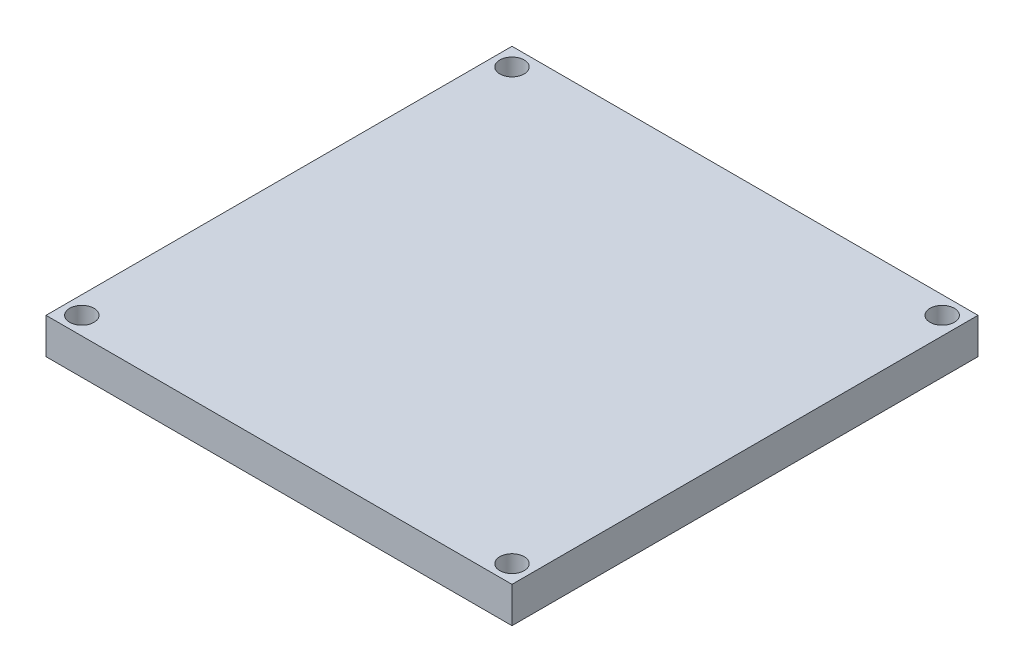
ISO-10303-21;
HEADER;
FILE_DESCRIPTION(('STEP AP214'),'2;1');
FILE_NAME('part.step','',(''),(''),'','','');
FILE_SCHEMA(('AUTOMOTIVE_DESIGN { 1 0 10303 214 1 1 1 1 }'));
ENDSEC;
DATA;
#1=APPLICATION_CONTEXT('core data for automotive mechanical design processes');
#2=APPLICATION_PROTOCOL_DEFINITION('international standard','automotive_design',2000,#1);
#3=PRODUCT_CONTEXT('',#1,'mechanical');
#4=PRODUCT('Part','Part','',(#3));
#5=PRODUCT_RELATED_PRODUCT_CATEGORY('part','',(#4));
#6=PRODUCT_DEFINITION_FORMATION('','',#4);
#7=PRODUCT_DEFINITION_CONTEXT('part definition',#1,'design');
#8=PRODUCT_DEFINITION('design','',#6,#7);
#9=PRODUCT_DEFINITION_SHAPE('','',#8);
#10=(LENGTH_UNIT() NAMED_UNIT(*) SI_UNIT(.MILLI.,.METRE.));
#11=(NAMED_UNIT(*) PLANE_ANGLE_UNIT() SI_UNIT($,.RADIAN.));
#12=(NAMED_UNIT(*) SI_UNIT($,.STERADIAN.) SOLID_ANGLE_UNIT());
#13=UNCERTAINTY_MEASURE_WITH_UNIT(LENGTH_MEASURE(1.E-05),#10,'distance_accuracy_value','');
#14=(GEOMETRIC_REPRESENTATION_CONTEXT(3) GLOBAL_UNCERTAINTY_ASSIGNED_CONTEXT((#13)) GLOBAL_UNIT_ASSIGNED_CONTEXT((#10,
#11,#12)) REPRESENTATION_CONTEXT('',''));
#15=CARTESIAN_POINT('',(0.,0.,0.));
#16=DIRECTION('',(0.,0.,1.));
#17=DIRECTION('',(1.,0.,0.));
#18=AXIS2_PLACEMENT_3D('',#15,#16,#17);
#19=CARTESIAN_POINT('',(0.,5.,0.));
#20=DIRECTION('',(0.,-1.,0.));
#21=DIRECTION('',(0.,0.,-1.));
#22=AXIS2_PLACEMENT_3D('',#19,#20,#21);
#23=PLANE('',#22);
#24=DIRECTION('',(0.,0.,1.));
#25=VECTOR('',#24,1.);
#26=CARTESIAN_POINT('',(0.,5.,0.));
#27=LINE('',#26,#25);
#28=CARTESIAN_POINT('',(0.,5.,-65.));
#29=VERTEX_POINT('',#28);
#30=CARTESIAN_POINT('',(0.,5.,0.));
#31=VERTEX_POINT('',#30);
#32=EDGE_CURVE('E98',#29,#31,#27,.T.);
#33=ORIENTED_EDGE('',*,*,#32,.T.);
#34=DIRECTION('',(1.,0.,0.));
#35=VECTOR('',#34,1.);
#36=CARTESIAN_POINT('',(0.,5.,0.));
#37=LINE('',#36,#35);
#38=CARTESIAN_POINT('',(65.,5.,0.));
#39=VERTEX_POINT('',#38);
#40=EDGE_CURVE('E93',#31,#39,#37,.T.);
#41=ORIENTED_EDGE('',*,*,#40,.T.);
#42=DIRECTION('',(0.,0.,-1.));
#43=VECTOR('',#42,1.);
#44=CARTESIAN_POINT('',(65.,5.,0.));
#45=LINE('',#44,#43);
#46=CARTESIAN_POINT('',(65.,5.,-65.));
#47=VERTEX_POINT('',#46);
#48=EDGE_CURVE('E96',#39,#47,#45,.T.);
#49=ORIENTED_EDGE('',*,*,#48,.T.);
#50=DIRECTION('',(-1.,0.,0.));
#51=VECTOR('',#50,1.);
#52=CARTESIAN_POINT('',(0.,5.,-65.));
#53=LINE('',#52,#51);
#54=EDGE_CURVE('E63',#47,#29,#53,.T.);
#55=ORIENTED_EDGE('',*,*,#54,.T.);
#56=EDGE_LOOP('',(#33,#41,#49,#55));
#57=FACE_BOUND('',#56,.T.);
#58=CARTESIAN_POINT('',(62.5,5.,-62.5));
#59=DIRECTION('',(0.,1.,0.));
#60=DIRECTION('',(0.,0.,1.));
#61=AXIS2_PLACEMENT_3D('',#58,#59,#60);
#62=CIRCLE('',#61,1.7);
#63=CARTESIAN_POINT('',(62.5,5.,-60.8));
#64=VERTEX_POINT('',#63);
#65=EDGE_CURVE('E118',#64,#64,#62,.T.);
#66=ORIENTED_EDGE('',*,*,#65,.F.);
#67=EDGE_LOOP('',(#66));
#68=FACE_BOUND('',#67,.T.);
#69=CARTESIAN_POINT('',(2.5,5.,-62.5));
#70=DIRECTION('',(0.,1.,0.));
#71=DIRECTION('',(0.,0.,-1.));
#72=AXIS2_PLACEMENT_3D('',#69,#70,#71);
#73=CIRCLE('',#72,1.69999999999999);
#74=CARTESIAN_POINT('',(2.5,5.,-64.2));
#75=VERTEX_POINT('',#74);
#76=EDGE_CURVE('E140',#75,#75,#73,.T.);
#77=ORIENTED_EDGE('',*,*,#76,.F.);
#78=EDGE_LOOP('',(#77));
#79=FACE_BOUND('',#78,.T.);
#80=CARTESIAN_POINT('',(62.5,5.,-2.49999999999999));
#81=DIRECTION('',(0.,1.,0.));
#82=DIRECTION('',(0.,0.,-1.));
#83=AXIS2_PLACEMENT_3D('',#80,#81,#82);
#84=CIRCLE('',#83,1.7);
#85=CARTESIAN_POINT('',(62.5,5.,-4.19999999999999));
#86=VERTEX_POINT('',#85);
#87=EDGE_CURVE('E148',#86,#86,#84,.T.);
#88=ORIENTED_EDGE('',*,*,#87,.F.);
#89=EDGE_LOOP('',(#88));
#90=FACE_BOUND('',#89,.T.);
#91=CARTESIAN_POINT('',(2.50000000000001,5.,-2.49999999999997));
#92=DIRECTION('',(0.,1.,0.));
#93=DIRECTION('',(0.,0.,1.));
#94=AXIS2_PLACEMENT_3D('',#91,#92,#93);
#95=CIRCLE('',#94,1.69999999999999);
#96=CARTESIAN_POINT('',(2.50000000000001,5.,-0.799999999999982));
#97=VERTEX_POINT('',#96);
#98=EDGE_CURVE('E156',#97,#97,#95,.T.);
#99=ORIENTED_EDGE('',*,*,#98,.F.);
#100=EDGE_LOOP('',(#99));
#101=FACE_BOUND('',#100,.T.);
#102=ADVANCED_FACE('F45',(#57,#68,#79,#90,#101),#23,.F.);
#103=CARTESIAN_POINT('',(0.,0.,0.));
#104=DIRECTION('',(0.,-1.,0.));
#105=DIRECTION('',(0.,0.,-1.));
#106=AXIS2_PLACEMENT_3D('',#103,#104,#105);
#107=PLANE('',#106);
#108=CARTESIAN_POINT('',(62.5,0.,-2.49999999999999));
#109=DIRECTION('',(0.,1.,0.));
#110=DIRECTION('',(0.,0.,-1.));
#111=AXIS2_PLACEMENT_3D('',#108,#109,#110);
#112=CIRCLE('',#111,1.7);
#113=CARTESIAN_POINT('',(62.5,0.,-4.19999999999999));
#114=VERTEX_POINT('',#113);
#115=EDGE_CURVE('E152',#114,#114,#112,.T.);
#116=ORIENTED_EDGE('',*,*,#115,.T.);
#117=EDGE_LOOP('',(#116));
#118=FACE_BOUND('',#117,.T.);
#119=CARTESIAN_POINT('',(62.5,0.,-62.5));
#120=DIRECTION('',(0.,1.,0.));
#121=DIRECTION('',(0.,0.,1.));
#122=AXIS2_PLACEMENT_3D('',#119,#120,#121);
#123=CIRCLE('',#122,1.7);
#124=CARTESIAN_POINT('',(62.5,0.,-60.8));
#125=VERTEX_POINT('',#124);
#126=EDGE_CURVE('E136',#125,#125,#123,.T.);
#127=ORIENTED_EDGE('',*,*,#126,.T.);
#128=EDGE_LOOP('',(#127));
#129=FACE_BOUND('',#128,.T.);
#130=DIRECTION('',(0.,0.,1.));
#131=VECTOR('',#130,1.);
#132=CARTESIAN_POINT('',(0.,0.,0.));
#133=LINE('',#132,#131);
#134=CARTESIAN_POINT('',(0.,0.,-65.));
#135=VERTEX_POINT('',#134);
#136=CARTESIAN_POINT('',(0.,0.,0.));
#137=VERTEX_POINT('',#136);
#138=EDGE_CURVE('E114',#135,#137,#133,.T.);
#139=ORIENTED_EDGE('',*,*,#138,.F.);
#140=DIRECTION('',(-1.,0.,0.));
#141=VECTOR('',#140,1.);
#142=CARTESIAN_POINT('',(0.,0.,-65.));
#143=LINE('',#142,#141);
#144=CARTESIAN_POINT('',(65.,0.,-65.));
#145=VERTEX_POINT('',#144);
#146=EDGE_CURVE('E86',#145,#135,#143,.T.);
#147=ORIENTED_EDGE('',*,*,#146,.F.);
#148=DIRECTION('',(0.,0.,-1.));
#149=VECTOR('',#148,1.);
#150=CARTESIAN_POINT('',(65.,0.,0.));
#151=LINE('',#150,#149);
#152=CARTESIAN_POINT('',(65.,0.,0.));
#153=VERTEX_POINT('',#152);
#154=EDGE_CURVE('E80',#153,#145,#151,.T.);
#155=ORIENTED_EDGE('',*,*,#154,.F.);
#156=DIRECTION('',(1.,0.,0.));
#157=VECTOR('',#156,1.);
#158=CARTESIAN_POINT('',(0.,0.,0.));
#159=LINE('',#158,#157);
#160=EDGE_CURVE('E103',#137,#153,#159,.T.);
#161=ORIENTED_EDGE('',*,*,#160,.F.);
#162=EDGE_LOOP('',(#139,#147,#155,#161));
#163=FACE_BOUND('',#162,.T.);
#164=CARTESIAN_POINT('',(2.5,0.,-62.5));
#165=DIRECTION('',(0.,1.,0.));
#166=DIRECTION('',(0.,0.,-1.));
#167=AXIS2_PLACEMENT_3D('',#164,#165,#166);
#168=CIRCLE('',#167,1.69999999999999);
#169=CARTESIAN_POINT('',(2.5,0.,-64.2));
#170=VERTEX_POINT('',#169);
#171=EDGE_CURVE('E144',#170,#170,#168,.T.);
#172=ORIENTED_EDGE('',*,*,#171,.T.);
#173=EDGE_LOOP('',(#172));
#174=FACE_BOUND('',#173,.T.);
#175=CARTESIAN_POINT('',(2.50000000000001,0.,-2.49999999999997));
#176=DIRECTION('',(0.,1.,0.));
#177=DIRECTION('',(0.,0.,1.));
#178=AXIS2_PLACEMENT_3D('',#175,#176,#177);
#179=CIRCLE('',#178,1.69999999999999);
#180=CARTESIAN_POINT('',(2.50000000000001,0.,-0.799999999999982));
#181=VERTEX_POINT('',#180);
#182=EDGE_CURVE('E160',#181,#181,#179,.T.);
#183=ORIENTED_EDGE('',*,*,#182,.T.);
#184=EDGE_LOOP('',(#183));
#185=FACE_BOUND('',#184,.T.);
#186=ADVANCED_FACE('F131',(#118,#129,#163,#174,#185),#107,.T.);
#187=CARTESIAN_POINT('',(0.,5.,0.));
#188=DIRECTION('',(1.,0.,0.));
#189=DIRECTION('',(0.,0.,-1.));
#190=AXIS2_PLACEMENT_3D('',#187,#188,#189);
#191=PLANE('',#190);
#192=ORIENTED_EDGE('',*,*,#138,.T.);
#193=DIRECTION('',(0.,-1.,0.));
#194=VECTOR('',#193,1.);
#195=CARTESIAN_POINT('',(0.,5.,0.));
#196=LINE('',#195,#194);
#197=EDGE_CURVE('E11',#31,#137,#196,.T.);
#198=ORIENTED_EDGE('',*,*,#197,.F.);
#199=ORIENTED_EDGE('',*,*,#32,.F.);
#200=DIRECTION('',(0.,-1.,0.));
#201=VECTOR('',#200,1.);
#202=CARTESIAN_POINT('',(0.,5.,-65.));
#203=LINE('',#202,#201);
#204=EDGE_CURVE('E110',#29,#135,#203,.T.);
#205=ORIENTED_EDGE('',*,*,#204,.T.);
#206=EDGE_LOOP('',(#192,#198,#199,#205));
#207=FACE_BOUND('',#206,.T.);
#208=ADVANCED_FACE('F47',(#207),#191,.F.);
#209=CARTESIAN_POINT('',(0.,5.,0.));
#210=DIRECTION('',(0.,0.,-1.));
#211=DIRECTION('',(-1.,0.,0.));
#212=AXIS2_PLACEMENT_3D('',#209,#210,#211);
#213=PLANE('',#212);
#214=ORIENTED_EDGE('',*,*,#160,.T.);
#215=DIRECTION('',(0.,-1.,0.));
#216=VECTOR('',#215,1.);
#217=CARTESIAN_POINT('',(65.,5.,0.));
#218=LINE('',#217,#216);
#219=EDGE_CURVE('E55',#39,#153,#218,.T.);
#220=ORIENTED_EDGE('',*,*,#219,.F.);
#221=ORIENTED_EDGE('',*,*,#40,.F.);
#222=ORIENTED_EDGE('',*,*,#197,.T.);
#223=EDGE_LOOP('',(#214,#220,#221,#222));
#224=FACE_BOUND('',#223,.T.);
#225=ADVANCED_FACE('F102',(#224),#213,.F.);
#226=CARTESIAN_POINT('',(65.,5.,0.));
#227=DIRECTION('',(-1.,0.,0.));
#228=DIRECTION('',(0.,0.,1.));
#229=AXIS2_PLACEMENT_3D('',#226,#227,#228);
#230=PLANE('',#229);
#231=ORIENTED_EDGE('',*,*,#154,.T.);
#232=DIRECTION('',(0.,-1.,0.));
#233=VECTOR('',#232,1.);
#234=CARTESIAN_POINT('',(65.,5.,-65.));
#235=LINE('',#234,#233);
#236=EDGE_CURVE('E105',#47,#145,#235,.T.);
#237=ORIENTED_EDGE('',*,*,#236,.F.);
#238=ORIENTED_EDGE('',*,*,#48,.F.);
#239=ORIENTED_EDGE('',*,*,#219,.T.);
#240=EDGE_LOOP('',(#231,#237,#238,#239));
#241=FACE_BOUND('',#240,.T.);
#242=ADVANCED_FACE('F106',(#241),#230,.F.);
#243=CARTESIAN_POINT('',(0.,5.,-65.));
#244=DIRECTION('',(0.,0.,1.));
#245=DIRECTION('',(1.,0.,0.));
#246=AXIS2_PLACEMENT_3D('',#243,#244,#245);
#247=PLANE('',#246);
#248=ORIENTED_EDGE('',*,*,#146,.T.);
#249=ORIENTED_EDGE('',*,*,#204,.F.);
#250=ORIENTED_EDGE('',*,*,#54,.F.);
#251=ORIENTED_EDGE('',*,*,#236,.T.);
#252=EDGE_LOOP('',(#248,#249,#250,#251));
#253=FACE_BOUND('',#252,.T.);
#254=ADVANCED_FACE('F128',(#253),#247,.F.);
#255=CARTESIAN_POINT('',(62.5,5.,-62.5));
#256=DIRECTION('',(0.,-1.,0.));
#257=DIRECTION('',(0.,0.,-1.));
#258=AXIS2_PLACEMENT_3D('',#255,#256,#257);
#259=CYLINDRICAL_SURFACE('',#258,1.7);
#260=ORIENTED_EDGE('',*,*,#65,.T.);
#261=EDGE_LOOP('',(#260));
#262=FACE_BOUND('',#261,.T.);
#263=ORIENTED_EDGE('',*,*,#126,.F.);
#264=EDGE_LOOP('',(#263));
#265=FACE_BOUND('',#264,.T.);
#266=ADVANCED_FACE('F179',(#262,#265),#259,.F.);
#267=CARTESIAN_POINT('',(2.5,5.,-62.5));
#268=DIRECTION('',(0.,-1.,0.));
#269=DIRECTION('',(0.,0.,-1.));
#270=AXIS2_PLACEMENT_3D('',#267,#268,#269);
#271=CYLINDRICAL_SURFACE('',#270,1.69999999999999);
#272=ORIENTED_EDGE('',*,*,#76,.T.);
#273=EDGE_LOOP('',(#272));
#274=FACE_BOUND('',#273,.T.);
#275=ORIENTED_EDGE('',*,*,#171,.F.);
#276=EDGE_LOOP('',(#275));
#277=FACE_BOUND('',#276,.T.);
#278=ADVANCED_FACE('F224',(#274,#277),#271,.F.);
#279=CARTESIAN_POINT('',(62.5,5.,-2.49999999999999));
#280=DIRECTION('',(0.,-1.,0.));
#281=DIRECTION('',(0.,0.,-1.));
#282=AXIS2_PLACEMENT_3D('',#279,#280,#281);
#283=CYLINDRICAL_SURFACE('',#282,1.7);
#284=ORIENTED_EDGE('',*,*,#87,.T.);
#285=EDGE_LOOP('',(#284));
#286=FACE_BOUND('',#285,.T.);
#287=ORIENTED_EDGE('',*,*,#115,.F.);
#288=EDGE_LOOP('',(#287));
#289=FACE_BOUND('',#288,.T.);
#290=ADVANCED_FACE('F232',(#286,#289),#283,.F.);
#291=CARTESIAN_POINT('',(2.50000000000001,5.,-2.49999999999997));
#292=DIRECTION('',(0.,-1.,0.));
#293=DIRECTION('',(0.,0.,-1.));
#294=AXIS2_PLACEMENT_3D('',#291,#292,#293);
#295=CYLINDRICAL_SURFACE('',#294,1.69999999999999);
#296=ORIENTED_EDGE('',*,*,#98,.T.);
#297=EDGE_LOOP('',(#296));
#298=FACE_BOUND('',#297,.T.);
#299=ORIENTED_EDGE('',*,*,#182,.F.);
#300=EDGE_LOOP('',(#299));
#301=FACE_BOUND('',#300,.T.);
#302=ADVANCED_FACE('F168',(#298,#301),#295,.F.);
#303=CLOSED_SHELL('',(#102,#186,#208,#225,#242,#254,#266,#278,#290,#302));
#304=MANIFOLD_SOLID_BREP('B2',#303);
#305=ADVANCED_BREP_SHAPE_REPRESENTATION('',(#18,#304),#14);
#306=SHAPE_DEFINITION_REPRESENTATION(#9,#305);
ENDSEC;
END-ISO-10303-21;
